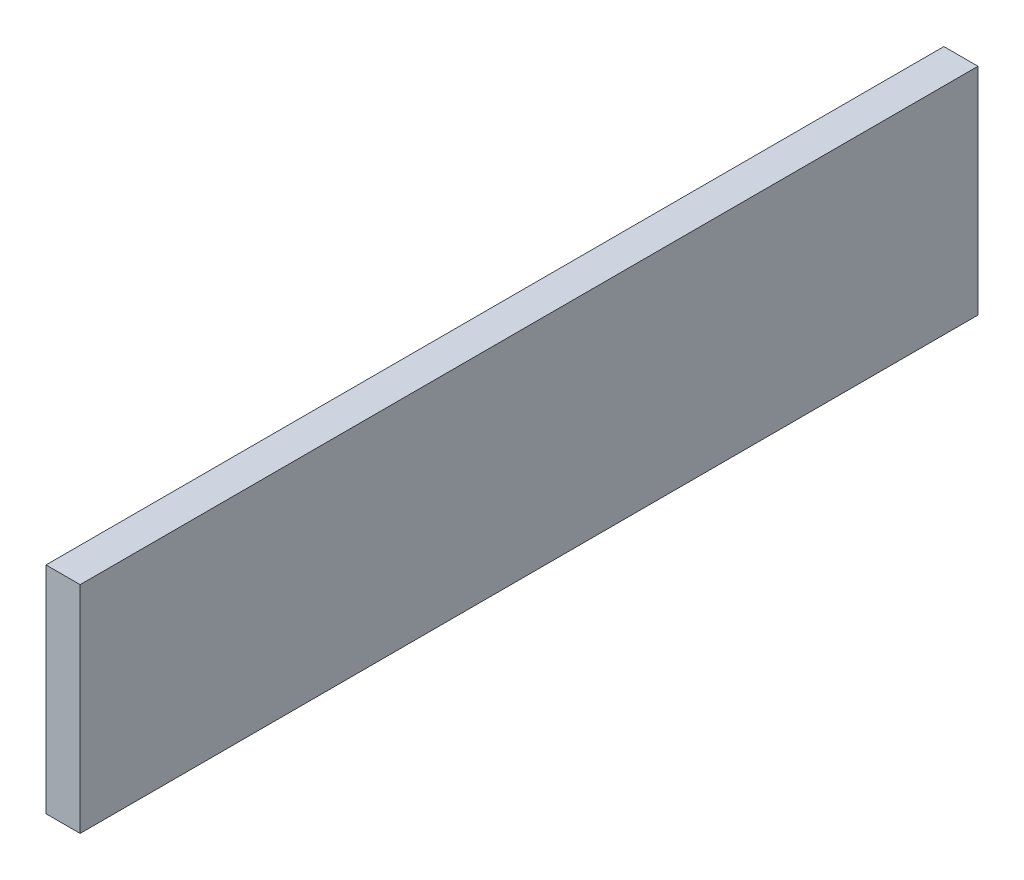
ISO-10303-21;
HEADER;
FILE_DESCRIPTION(('STEP AP214'),'2;1');
FILE_NAME('part.step','',(''),(''),'','','');
FILE_SCHEMA(('AUTOMOTIVE_DESIGN { 1 0 10303 214 1 1 1 1 }'));
ENDSEC;
DATA;
#1=APPLICATION_CONTEXT('core data for automotive mechanical design processes');
#2=APPLICATION_PROTOCOL_DEFINITION('international standard','automotive_design',2000,#1);
#3=PRODUCT_CONTEXT('',#1,'mechanical');
#4=PRODUCT('Part','Part','',(#3));
#5=PRODUCT_RELATED_PRODUCT_CATEGORY('part','',(#4));
#6=PRODUCT_DEFINITION_FORMATION('','',#4);
#7=PRODUCT_DEFINITION_CONTEXT('part definition',#1,'design');
#8=PRODUCT_DEFINITION('design','',#6,#7);
#9=PRODUCT_DEFINITION_SHAPE('','',#8);
#10=(LENGTH_UNIT() NAMED_UNIT(*) SI_UNIT(.MILLI.,.METRE.));
#11=(NAMED_UNIT(*) PLANE_ANGLE_UNIT() SI_UNIT($,.RADIAN.));
#12=(NAMED_UNIT(*) SI_UNIT($,.STERADIAN.) SOLID_ANGLE_UNIT());
#13=UNCERTAINTY_MEASURE_WITH_UNIT(LENGTH_MEASURE(1.E-05),#10,'distance_accuracy_value','');
#14=(GEOMETRIC_REPRESENTATION_CONTEXT(3) GLOBAL_UNCERTAINTY_ASSIGNED_CONTEXT((#13)) GLOBAL_UNIT_ASSIGNED_CONTEXT((#10,
#11,#12)) REPRESENTATION_CONTEXT('',''));
#15=CARTESIAN_POINT('',(0.,0.,0.));
#16=DIRECTION('',(0.,0.,1.));
#17=DIRECTION('',(1.,0.,0.));
#18=AXIS2_PLACEMENT_3D('',#15,#16,#17);
#19=CARTESIAN_POINT('',(19.,0.,0.));
#20=DIRECTION('',(0.,0.,-1.));
#21=DIRECTION('',(-1.,0.,0.));
#22=AXIS2_PLACEMENT_3D('',#19,#20,#21);
#23=PLANE('',#22);
#24=DIRECTION('',(0.,-1.,0.));
#25=VECTOR('',#24,1.);
#26=CARTESIAN_POINT('',(0.,0.,0.));
#27=LINE('',#26,#25);
#28=CARTESIAN_POINT('',(0.,120.,0.));
#29=VERTEX_POINT('',#28);
#30=CARTESIAN_POINT('',(0.,0.,0.));
#31=VERTEX_POINT('',#30);
#32=EDGE_CURVE('E96',#29,#31,#27,.T.);
#33=ORIENTED_EDGE('',*,*,#32,.T.);
#34=DIRECTION('',(-1.,0.,0.));
#35=VECTOR('',#34,1.);
#36=CARTESIAN_POINT('',(19.,0.,0.));
#37=LINE('',#36,#35);
#38=CARTESIAN_POINT('',(19.,0.,0.));
#39=VERTEX_POINT('',#38);
#40=EDGE_CURVE('E11',#39,#31,#37,.T.);
#41=ORIENTED_EDGE('',*,*,#40,.F.);
#42=DIRECTION('',(0.,-1.,0.));
#43=VECTOR('',#42,1.);
#44=CARTESIAN_POINT('',(19.,0.,0.));
#45=LINE('',#44,#43);
#46=CARTESIAN_POINT('',(19.,120.,0.));
#47=VERTEX_POINT('',#46);
#48=EDGE_CURVE('E84',#47,#39,#45,.T.);
#49=ORIENTED_EDGE('',*,*,#48,.F.);
#50=DIRECTION('',(-1.,0.,0.));
#51=VECTOR('',#50,1.);
#52=CARTESIAN_POINT('',(19.,120.,0.));
#53=LINE('',#52,#51);
#54=EDGE_CURVE('E92',#47,#29,#53,.T.);
#55=ORIENTED_EDGE('',*,*,#54,.T.);
#56=EDGE_LOOP('',(#33,#41,#49,#55));
#57=FACE_BOUND('',#56,.T.);
#58=ADVANCED_FACE('F33',(#57),#23,.F.);
#59=CARTESIAN_POINT('',(19.,0.,0.));
#60=DIRECTION('',(0.,1.,0.));
#61=DIRECTION('',(0.,0.,1.));
#62=AXIS2_PLACEMENT_3D('',#59,#60,#61);
#63=PLANE('',#62);
#64=DIRECTION('',(0.,0.,-1.));
#65=VECTOR('',#64,1.);
#66=CARTESIAN_POINT('',(0.,0.,0.));
#67=LINE('',#66,#65);
#68=CARTESIAN_POINT('',(0.,0.,-500.));
#69=VERTEX_POINT('',#68);
#70=EDGE_CURVE('E88',#31,#69,#67,.T.);
#71=ORIENTED_EDGE('',*,*,#70,.T.);
#72=DIRECTION('',(-1.,0.,0.));
#73=VECTOR('',#72,1.);
#74=CARTESIAN_POINT('',(19.,0.,-500.));
#75=LINE('',#74,#73);
#76=CARTESIAN_POINT('',(19.,0.,-500.));
#77=VERTEX_POINT('',#76);
#78=EDGE_CURVE('E41',#77,#69,#75,.T.);
#79=ORIENTED_EDGE('',*,*,#78,.F.);
#80=DIRECTION('',(0.,0.,-1.));
#81=VECTOR('',#80,1.);
#82=CARTESIAN_POINT('',(19.,0.,0.));
#83=LINE('',#82,#81);
#84=EDGE_CURVE('E79',#39,#77,#83,.T.);
#85=ORIENTED_EDGE('',*,*,#84,.F.);
#86=ORIENTED_EDGE('',*,*,#40,.T.);
#87=EDGE_LOOP('',(#71,#79,#85,#86));
#88=FACE_BOUND('',#87,.T.);
#89=ADVANCED_FACE('F87',(#88),#63,.F.);
#90=CARTESIAN_POINT('',(19.,0.,-500.));
#91=DIRECTION('',(0.,0.,1.));
#92=DIRECTION('',(1.,0.,0.));
#93=AXIS2_PLACEMENT_3D('',#90,#91,#92);
#94=PLANE('',#93);
#95=DIRECTION('',(0.,1.,0.));
#96=VECTOR('',#95,1.);
#97=CARTESIAN_POINT('',(0.,0.,-500.));
#98=LINE('',#97,#96);
#99=CARTESIAN_POINT('',(0.,120.,-500.));
#100=VERTEX_POINT('',#99);
#101=EDGE_CURVE('E66',#69,#100,#98,.T.);
#102=ORIENTED_EDGE('',*,*,#101,.T.);
#103=DIRECTION('',(-1.,0.,0.));
#104=VECTOR('',#103,1.);
#105=CARTESIAN_POINT('',(19.,120.,-500.));
#106=LINE('',#105,#104);
#107=CARTESIAN_POINT('',(19.,120.,-500.));
#108=VERTEX_POINT('',#107);
#109=EDGE_CURVE('E89',#108,#100,#106,.T.);
#110=ORIENTED_EDGE('',*,*,#109,.F.);
#111=DIRECTION('',(0.,1.,0.));
#112=VECTOR('',#111,1.);
#113=CARTESIAN_POINT('',(19.,0.,-500.));
#114=LINE('',#113,#112);
#115=EDGE_CURVE('E82',#77,#108,#114,.T.);
#116=ORIENTED_EDGE('',*,*,#115,.F.);
#117=ORIENTED_EDGE('',*,*,#78,.T.);
#118=EDGE_LOOP('',(#102,#110,#116,#117));
#119=FACE_BOUND('',#118,.T.);
#120=ADVANCED_FACE('F90',(#119),#94,.F.);
#121=CARTESIAN_POINT('',(19.,120.,0.));
#122=DIRECTION('',(0.,-1.,0.));
#123=DIRECTION('',(0.,0.,-1.));
#124=AXIS2_PLACEMENT_3D('',#121,#122,#123);
#125=PLANE('',#124);
#126=DIRECTION('',(0.,0.,1.));
#127=VECTOR('',#126,1.);
#128=CARTESIAN_POINT('',(0.,120.,0.));
#129=LINE('',#128,#127);
#130=EDGE_CURVE('E72',#100,#29,#129,.T.);
#131=ORIENTED_EDGE('',*,*,#130,.T.);
#132=ORIENTED_EDGE('',*,*,#54,.F.);
#133=DIRECTION('',(0.,0.,1.));
#134=VECTOR('',#133,1.);
#135=CARTESIAN_POINT('',(19.,120.,0.));
#136=LINE('',#135,#134);
#137=EDGE_CURVE('E49',#108,#47,#136,.T.);
#138=ORIENTED_EDGE('',*,*,#137,.F.);
#139=ORIENTED_EDGE('',*,*,#109,.T.);
#140=EDGE_LOOP('',(#131,#132,#138,#139));
#141=FACE_BOUND('',#140,.T.);
#142=ADVANCED_FACE('F103',(#141),#125,.F.);
#143=CARTESIAN_POINT('',(19.,0.,0.));
#144=DIRECTION('',(-1.,0.,0.));
#145=DIRECTION('',(0.,0.,1.));
#146=AXIS2_PLACEMENT_3D('',#143,#144,#145);
#147=PLANE('',#146);
#148=ORIENTED_EDGE('',*,*,#48,.T.);
#149=ORIENTED_EDGE('',*,*,#84,.T.);
#150=ORIENTED_EDGE('',*,*,#115,.T.);
#151=ORIENTED_EDGE('',*,*,#137,.T.);
#152=EDGE_LOOP('',(#148,#149,#150,#151));
#153=FACE_BOUND('',#152,.T.);
#154=ADVANCED_FACE('F80',(#153),#147,.F.);
#155=CARTESIAN_POINT('',(0.,0.,0.));
#156=DIRECTION('',(-1.,0.,0.));
#157=DIRECTION('',(0.,0.,1.));
#158=AXIS2_PLACEMENT_3D('',#155,#156,#157);
#159=PLANE('',#158);
#160=ORIENTED_EDGE('',*,*,#32,.F.);
#161=ORIENTED_EDGE('',*,*,#130,.F.);
#162=ORIENTED_EDGE('',*,*,#101,.F.);
#163=ORIENTED_EDGE('',*,*,#70,.F.);
#164=EDGE_LOOP('',(#160,#161,#162,#163));
#165=FACE_BOUND('',#164,.T.);
#166=ADVANCED_FACE('F106',(#165),#159,.T.);
#167=CLOSED_SHELL('',(#58,#89,#120,#142,#154,#166));
#168=MANIFOLD_SOLID_BREP('B2',#167);
#169=ADVANCED_BREP_SHAPE_REPRESENTATION('',(#18,#168),#14);
#170=SHAPE_DEFINITION_REPRESENTATION(#9,#169);
ENDSEC;
END-ISO-10303-21;
